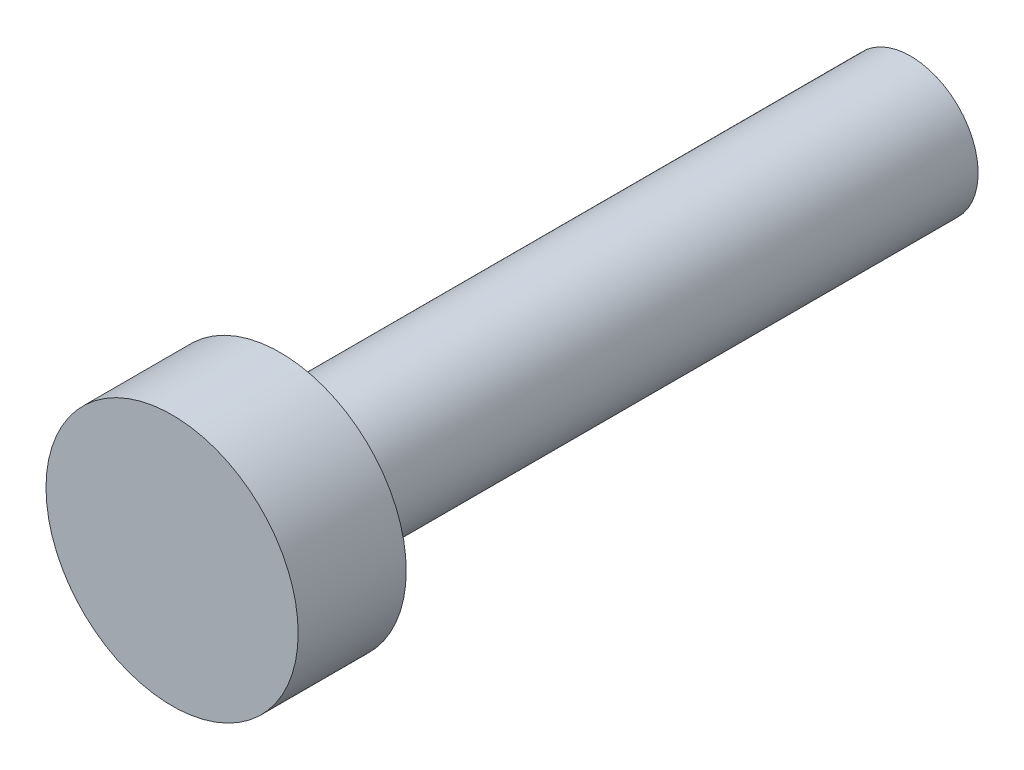
ISO-10303-21;
HEADER;
FILE_DESCRIPTION(('STEP AP214'),'2;1');
FILE_NAME('part.step','',(''),(''),'','','');
FILE_SCHEMA(('AUTOMOTIVE_DESIGN { 1 0 10303 214 1 1 1 1 }'));
ENDSEC;
DATA;
#1=APPLICATION_CONTEXT('core data for automotive mechanical design processes');
#2=APPLICATION_PROTOCOL_DEFINITION('international standard','automotive_design',2000,#1);
#3=PRODUCT_CONTEXT('',#1,'mechanical');
#4=PRODUCT('Part','Part','',(#3));
#5=PRODUCT_RELATED_PRODUCT_CATEGORY('part','',(#4));
#6=PRODUCT_DEFINITION_FORMATION('','',#4);
#7=PRODUCT_DEFINITION_CONTEXT('part definition',#1,'design');
#8=PRODUCT_DEFINITION('design','',#6,#7);
#9=PRODUCT_DEFINITION_SHAPE('','',#8);
#10=(LENGTH_UNIT() NAMED_UNIT(*) SI_UNIT(.MILLI.,.METRE.));
#11=(NAMED_UNIT(*) PLANE_ANGLE_UNIT() SI_UNIT($,.RADIAN.));
#12=(NAMED_UNIT(*) SI_UNIT($,.STERADIAN.) SOLID_ANGLE_UNIT());
#13=UNCERTAINTY_MEASURE_WITH_UNIT(LENGTH_MEASURE(1.E-05),#10,'distance_accuracy_value','');
#14=(GEOMETRIC_REPRESENTATION_CONTEXT(3) GLOBAL_UNCERTAINTY_ASSIGNED_CONTEXT((#13)) GLOBAL_UNIT_ASSIGNED_CONTEXT((#10,
#11,#12)) REPRESENTATION_CONTEXT('',''));
#15=CARTESIAN_POINT('',(0.,0.,0.));
#16=DIRECTION('',(0.,0.,1.));
#17=DIRECTION('',(1.,0.,0.));
#18=AXIS2_PLACEMENT_3D('',#15,#16,#17);
#19=CARTESIAN_POINT('',(0.,0.,2.4));
#20=DIRECTION('',(0.,0.,-1.));
#21=DIRECTION('',(-1.,0.,0.));
#22=AXIS2_PLACEMENT_3D('',#19,#20,#21);
#23=CYLINDRICAL_SURFACE('',#22,2.8);
#24=CARTESIAN_POINT('',(0.,0.,2.4));
#25=DIRECTION('',(0.,0.,1.));
#26=DIRECTION('',(1.,0.,0.));
#27=AXIS2_PLACEMENT_3D('',#24,#25,#26);
#28=CIRCLE('',#27,2.8);
#29=CARTESIAN_POINT('',(2.8,0.,2.4));
#30=VERTEX_POINT('',#29);
#31=EDGE_CURVE('E37',#30,#30,#28,.T.);
#32=ORIENTED_EDGE('',*,*,#31,.F.);
#33=EDGE_LOOP('',(#32));
#34=FACE_BOUND('',#33,.T.);
#35=CARTESIAN_POINT('',(0.,0.,0.));
#36=DIRECTION('',(0.,0.,1.));
#37=DIRECTION('',(1.,0.,0.));
#38=AXIS2_PLACEMENT_3D('',#35,#36,#37);
#39=CIRCLE('',#38,2.8);
#40=CARTESIAN_POINT('',(2.8,0.,0.));
#41=VERTEX_POINT('',#40);
#42=EDGE_CURVE('E33',#41,#41,#39,.T.);
#43=ORIENTED_EDGE('',*,*,#42,.T.);
#44=EDGE_LOOP('',(#43));
#45=FACE_BOUND('',#44,.T.);
#46=ADVANCED_FACE('F30',(#34,#45),#23,.T.);
#47=CARTESIAN_POINT('',(0.,0.,2.4));
#48=DIRECTION('',(0.,0.,1.));
#49=DIRECTION('',(1.,0.,0.));
#50=AXIS2_PLACEMENT_3D('',#47,#48,#49);
#51=PLANE('',#50);
#52=ORIENTED_EDGE('',*,*,#31,.T.);
#53=EDGE_LOOP('',(#52));
#54=FACE_BOUND('',#53,.T.);
#55=ADVANCED_FACE('F54',(#54),#51,.T.);
#56=CARTESIAN_POINT('',(0.,0.,0.));
#57=DIRECTION('',(0.,0.,1.));
#58=DIRECTION('',(1.,0.,0.));
#59=AXIS2_PLACEMENT_3D('',#56,#57,#58);
#60=PLANE('',#59);
#61=CARTESIAN_POINT('',(0.,0.,0.));
#62=DIRECTION('',(0.,0.,-1.));
#63=DIRECTION('',(-1.,0.,0.));
#64=AXIS2_PLACEMENT_3D('',#61,#62,#63);
#65=CIRCLE('',#64,1.5);
#66=CARTESIAN_POINT('',(-1.5,0.,0.));
#67=VERTEX_POINT('',#66);
#68=EDGE_CURVE('E10',#67,#67,#65,.T.);
#69=ORIENTED_EDGE('',*,*,#68,.F.);
#70=EDGE_LOOP('',(#69));
#71=FACE_BOUND('',#70,.T.);
#72=ORIENTED_EDGE('',*,*,#42,.F.);
#73=EDGE_LOOP('',(#72));
#74=FACE_BOUND('',#73,.T.);
#75=ADVANCED_FACE('F51',(#71,#74),#60,.F.);
#76=CARTESIAN_POINT('',(0.,0.,-14.));
#77=DIRECTION('',(0.,0.,1.));
#78=DIRECTION('',(1.,0.,0.));
#79=AXIS2_PLACEMENT_3D('',#76,#77,#78);
#80=CYLINDRICAL_SURFACE('',#79,1.5);
#81=CARTESIAN_POINT('',(0.,0.,-14.));
#82=DIRECTION('',(0.,0.,-1.));
#83=DIRECTION('',(-1.,0.,0.));
#84=AXIS2_PLACEMENT_3D('',#81,#82,#83);
#85=CIRCLE('',#84,1.5);
#86=CARTESIAN_POINT('',(-1.5,0.,-14.));
#87=VERTEX_POINT('',#86);
#88=EDGE_CURVE('E43',#87,#87,#85,.T.);
#89=ORIENTED_EDGE('',*,*,#88,.F.);
#90=EDGE_LOOP('',(#89));
#91=FACE_BOUND('',#90,.T.);
#92=ORIENTED_EDGE('',*,*,#68,.T.);
#93=EDGE_LOOP('',(#92));
#94=FACE_BOUND('',#93,.T.);
#95=ADVANCED_FACE('F53',(#91,#94),#80,.T.);
#96=CARTESIAN_POINT('',(0.,0.,-14.));
#97=DIRECTION('',(0.,0.,-1.));
#98=DIRECTION('',(-1.,0.,0.));
#99=AXIS2_PLACEMENT_3D('',#96,#97,#98);
#100=PLANE('',#99);
#101=ORIENTED_EDGE('',*,*,#88,.T.);
#102=EDGE_LOOP('',(#101));
#103=FACE_BOUND('',#102,.T.);
#104=ADVANCED_FACE('F60',(#103),#100,.T.);
#105=CLOSED_SHELL('',(#46,#55,#75,#95,#104));
#106=MANIFOLD_SOLID_BREP('B2',#105);
#107=ADVANCED_BREP_SHAPE_REPRESENTATION('',(#18,#106),#14);
#108=SHAPE_DEFINITION_REPRESENTATION(#9,#107);
ENDSEC;
END-ISO-10303-21;
